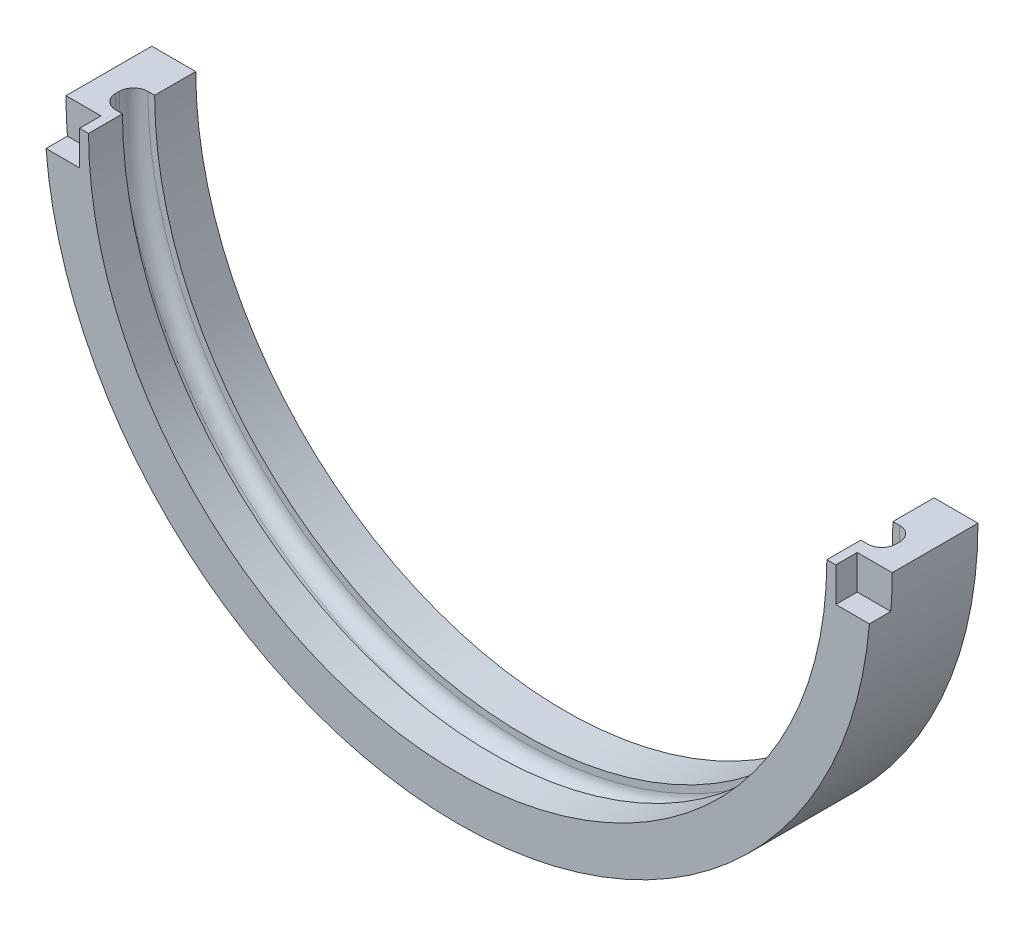
ISO-10303-21;
HEADER;
FILE_DESCRIPTION(('STEP AP214'),'2;1');
FILE_NAME('part.step','',(''),(''),'','','');
FILE_SCHEMA(('AUTOMOTIVE_DESIGN { 1 0 10303 214 1 1 1 1 }'));
ENDSEC;
DATA;
#1=APPLICATION_CONTEXT('core data for automotive mechanical design processes');
#2=APPLICATION_PROTOCOL_DEFINITION('international standard','automotive_design',2000,#1);
#3=PRODUCT_CONTEXT('',#1,'mechanical');
#4=PRODUCT('Part','Part','',(#3));
#5=PRODUCT_RELATED_PRODUCT_CATEGORY('part','',(#4));
#6=PRODUCT_DEFINITION_FORMATION('','',#4);
#7=PRODUCT_DEFINITION_CONTEXT('part definition',#1,'design');
#8=PRODUCT_DEFINITION('design','',#6,#7);
#9=PRODUCT_DEFINITION_SHAPE('','',#8);
#10=(LENGTH_UNIT() NAMED_UNIT(*) SI_UNIT(.MILLI.,.METRE.));
#11=(NAMED_UNIT(*) PLANE_ANGLE_UNIT() SI_UNIT($,.RADIAN.));
#12=(NAMED_UNIT(*) SI_UNIT($,.STERADIAN.) SOLID_ANGLE_UNIT());
#13=UNCERTAINTY_MEASURE_WITH_UNIT(LENGTH_MEASURE(1.E-05),#10,'distance_accuracy_value','');
#14=(GEOMETRIC_REPRESENTATION_CONTEXT(3) GLOBAL_UNCERTAINTY_ASSIGNED_CONTEXT((#13)) GLOBAL_UNIT_ASSIGNED_CONTEXT((#10,
#11,#12)) REPRESENTATION_CONTEXT('',''));
#15=CARTESIAN_POINT('',(0.,0.,0.));
#16=DIRECTION('',(0.,0.,1.));
#17=DIRECTION('',(1.,0.,0.));
#18=AXIS2_PLACEMENT_3D('',#15,#16,#17);
#19=CARTESIAN_POINT('',(0.,73.406,5.715));
#20=DIRECTION('',(0.,0.,-1.));
#21=DIRECTION('',(-1.,0.,0.));
#22=AXIS2_PLACEMENT_3D('',#19,#20,#21);
#23=CYLINDRICAL_SURFACE('',#22,69.342);
#24=DIRECTION('',(0.,0.,-1.));
#25=VECTOR('',#24,1.);
#26=CARTESIAN_POINT('',(-69.342,73.406,5.715));
#27=LINE('',#26,#25);
#28=CARTESIAN_POINT('',(-69.342,73.406,3.175));
#29=VERTEX_POINT('',#28);
#30=CARTESIAN_POINT('',(-69.342,73.406,2.54));
#31=VERTEX_POINT('',#30);
#32=EDGE_CURVE('E254',#29,#31,#27,.T.);
#33=ORIENTED_EDGE('',*,*,#32,.F.);
#34=CARTESIAN_POINT('',(0.,73.406,3.175));
#35=DIRECTION('',(0.,0.,1.));
#36=DIRECTION('',(1.,0.,0.));
#37=AXIS2_PLACEMENT_3D('',#34,#35,#36);
#38=CIRCLE('',#37,69.342);
#39=CARTESIAN_POINT('',(69.342,73.406,3.175));
#40=VERTEX_POINT('',#39);
#41=EDGE_CURVE('E259',#29,#40,#38,.T.);
#42=ORIENTED_EDGE('',*,*,#41,.T.);
#43=DIRECTION('',(0.,0.,-1.));
#44=VECTOR('',#43,1.);
#45=CARTESIAN_POINT('',(69.342,73.406,5.715));
#46=LINE('',#45,#44);
#47=CARTESIAN_POINT('',(69.342,73.406,2.54));
#48=VERTEX_POINT('',#47);
#49=EDGE_CURVE('E248',#40,#48,#46,.T.);
#50=ORIENTED_EDGE('',*,*,#49,.T.);
#51=CARTESIAN_POINT('',(0.,73.406,2.54));
#52=DIRECTION('',(0.,0.,-1.));
#53=DIRECTION('',(-1.,0.,0.));
#54=AXIS2_PLACEMENT_3D('',#51,#52,#53);
#55=CIRCLE('',#54,69.342);
#56=EDGE_CURVE('E257',#48,#31,#55,.T.);
#57=ORIENTED_EDGE('',*,*,#56,.T.);
#58=EDGE_LOOP('',(#33,#42,#50,#57));
#59=FACE_BOUND('',#58,.T.);
#60=ADVANCED_FACE('F37',(#59),#23,.F.);
#61=CARTESIAN_POINT('',(0.,73.406,5.715));
#62=DIRECTION('',(0.,-1.,0.));
#63=DIRECTION('',(0.,0.,-1.));
#64=AXIS2_PLACEMENT_3D('',#61,#62,#63);
#65=PLANE('',#64);
#66=DIRECTION('',(-1.,0.,0.));
#67=VECTOR('',#66,1.);
#68=CARTESIAN_POINT('',(-67.1838804106557,73.406,7.9375));
#69=LINE('',#68,#67);
#70=CARTESIAN_POINT('',(-67.1838804106557,73.406,7.9375));
#71=VERTEX_POINT('',#70);
#72=CARTESIAN_POINT('',(-73.406,73.406,7.9375));
#73=VERTEX_POINT('',#72);
#74=EDGE_CURVE('E167',#71,#73,#69,.T.);
#75=ORIENTED_EDGE('',*,*,#74,.F.);
#76=DIRECTION('',(0.,0.,1.));
#77=VECTOR('',#76,1.);
#78=CARTESIAN_POINT('',(-67.1838804106557,73.406,7.9375));
#79=LINE('',#78,#77);
#80=CARTESIAN_POINT('',(-67.1838804106557,73.406,11.7475));
#81=VERTEX_POINT('',#80);
#82=EDGE_CURVE('E151',#71,#81,#79,.T.);
#83=ORIENTED_EDGE('',*,*,#82,.T.);
#84=DIRECTION('',(-1.,0.,0.));
#85=VECTOR('',#84,1.);
#86=CARTESIAN_POINT('',(0.,73.406,11.7475));
#87=LINE('',#86,#85);
#88=CARTESIAN_POINT('',(-65.5955,73.406,11.7475));
#89=VERTEX_POINT('',#88);
#90=EDGE_CURVE('E228',#89,#81,#87,.T.);
#91=ORIENTED_EDGE('',*,*,#90,.F.);
#92=DIRECTION('',(0.,0.,-1.));
#93=VECTOR('',#92,1.);
#94=CARTESIAN_POINT('',(-65.5955,73.406,11.7475));
#95=LINE('',#94,#93);
#96=CARTESIAN_POINT('',(-65.5955,73.406,5.715));
#97=VERTEX_POINT('',#96);
#98=EDGE_CURVE('E246',#89,#97,#95,.T.);
#99=ORIENTED_EDGE('',*,*,#98,.T.);
#100=DIRECTION('',(-1.,0.,0.));
#101=VECTOR('',#100,1.);
#102=CARTESIAN_POINT('',(0.,73.406,5.715));
#103=LINE('',#102,#101);
#104=CARTESIAN_POINT('',(-66.802,73.406,5.715));
#105=VERTEX_POINT('',#104);
#106=EDGE_CURVE('E240',#97,#105,#103,.T.);
#107=ORIENTED_EDGE('',*,*,#106,.T.);
#108=CARTESIAN_POINT('',(-66.802,73.406,3.175));
#109=DIRECTION('',(0.,-1.,0.));
#110=DIRECTION('',(0.,0.,-1.));
#111=AXIS2_PLACEMENT_3D('',#108,#109,#110);
#112=CIRCLE('',#111,2.54);
#113=EDGE_CURVE('E269',#105,#29,#112,.T.);
#114=ORIENTED_EDGE('',*,*,#113,.T.);
#115=ORIENTED_EDGE('',*,*,#32,.T.);
#116=CARTESIAN_POINT('',(-66.802,73.406,2.54));
#117=DIRECTION('',(0.,-1.,0.));
#118=DIRECTION('',(0.,0.,-1.));
#119=AXIS2_PLACEMENT_3D('',#116,#117,#118);
#120=CIRCLE('',#119,2.54);
#121=CARTESIAN_POINT('',(-66.802,73.406,0.));
#122=VERTEX_POINT('',#121);
#123=EDGE_CURVE('E273',#31,#122,#120,.T.);
#124=ORIENTED_EDGE('',*,*,#123,.T.);
#125=DIRECTION('',(-1.,0.,0.));
#126=VECTOR('',#125,1.);
#127=CARTESIAN_POINT('',(0.,73.406,0.));
#128=LINE('',#127,#126);
#129=CARTESIAN_POINT('',(-65.5955,73.406,0.));
#130=VERTEX_POINT('',#129);
#131=EDGE_CURVE('E205',#130,#122,#128,.T.);
#132=ORIENTED_EDGE('',*,*,#131,.F.);
#133=DIRECTION('',(0.,0.,1.));
#134=VECTOR('',#133,1.);
#135=CARTESIAN_POINT('',(-65.5955,73.406,-7.3025));
#136=LINE('',#135,#134);
#137=CARTESIAN_POINT('',(-65.5955,73.406,-7.3025));
#138=VERTEX_POINT('',#137);
#139=EDGE_CURVE('E213',#138,#130,#136,.T.);
#140=ORIENTED_EDGE('',*,*,#139,.F.);
#141=DIRECTION('',(-1.,0.,0.));
#142=VECTOR('',#141,1.);
#143=CARTESIAN_POINT('',(0.,73.406,-7.3025));
#144=LINE('',#143,#142);
#145=CARTESIAN_POINT('',(-73.406,73.406,-7.3025));
#146=VERTEX_POINT('',#145);
#147=EDGE_CURVE('E211',#138,#146,#144,.T.);
#148=ORIENTED_EDGE('',*,*,#147,.T.);
#149=DIRECTION('',(0.,0.,-1.));
#150=VECTOR('',#149,1.);
#151=CARTESIAN_POINT('',(-73.406,73.406,5.715));
#152=LINE('',#151,#150);
#153=EDGE_CURVE('E173',#73,#146,#152,.T.);
#154=ORIENTED_EDGE('',*,*,#153,.F.);
#155=EDGE_LOOP('',(#75,#83,#91,#99,#107,#114,#115,#124,#132,#140,#148,#154));
#156=FACE_BOUND('',#155,.T.);
#157=ADVANCED_FACE('F171',(#156),#65,.F.);
#158=CARTESIAN_POINT('',(0.,73.406,5.715));
#159=DIRECTION('',(0.,0.,-1.));
#160=DIRECTION('',(-1.,0.,0.));
#161=AXIS2_PLACEMENT_3D('',#158,#159,#160);
#162=CYLINDRICAL_SURFACE('',#161,73.406);
#163=CARTESIAN_POINT('',(0.,73.406,11.7475));
#164=DIRECTION('',(0.,0.,1.));
#165=DIRECTION('',(1.,0.,0.));
#166=AXIS2_PLACEMENT_3D('',#163,#164,#165);
#167=CIRCLE('',#166,73.406);
#168=CARTESIAN_POINT('',(-73.1524409708931,67.31,11.7475));
#169=VERTEX_POINT('',#168);
#170=CARTESIAN_POINT('',(73.1524409708931,67.31,11.7475));
#171=VERTEX_POINT('',#170);
#172=EDGE_CURVE('E231',#169,#171,#167,.T.);
#173=ORIENTED_EDGE('',*,*,#172,.F.);
#174=DIRECTION('',(0.,0.,-1.));
#175=VECTOR('',#174,1.);
#176=CARTESIAN_POINT('',(-73.1524409708931,67.31,5.715));
#177=LINE('',#176,#175);
#178=CARTESIAN_POINT('',(-73.1524409708931,67.31,7.9375));
#179=VERTEX_POINT('',#178);
#180=EDGE_CURVE('E60',#169,#179,#177,.T.);
#181=ORIENTED_EDGE('',*,*,#180,.T.);
#182=CARTESIAN_POINT('',(0.,73.406,7.9375));
#183=DIRECTION('',(0.,0.,-1.));
#184=DIRECTION('',(-1.,0.,0.));
#185=AXIS2_PLACEMENT_3D('',#182,#183,#184);
#186=CIRCLE('',#185,73.406);
#187=EDGE_CURVE('E12',#179,#73,#186,.T.);
#188=ORIENTED_EDGE('',*,*,#187,.T.);
#189=ORIENTED_EDGE('',*,*,#153,.T.);
#190=CARTESIAN_POINT('',(0.,73.406,-7.3025));
#191=DIRECTION('',(0.,0.,-1.));
#192=DIRECTION('',(-1.,0.,0.));
#193=AXIS2_PLACEMENT_3D('',#190,#191,#192);
#194=CIRCLE('',#193,73.406);
#195=CARTESIAN_POINT('',(73.406,73.406,-7.3025));
#196=VERTEX_POINT('',#195);
#197=EDGE_CURVE('E208',#196,#146,#194,.T.);
#198=ORIENTED_EDGE('',*,*,#197,.F.);
#199=DIRECTION('',(0.,0.,-1.));
#200=VECTOR('',#199,1.);
#201=CARTESIAN_POINT('',(73.406,73.406,5.715));
#202=LINE('',#201,#200);
#203=CARTESIAN_POINT('',(73.406,73.406,7.9375));
#204=VERTEX_POINT('',#203);
#205=EDGE_CURVE('E251',#204,#196,#202,.T.);
#206=ORIENTED_EDGE('',*,*,#205,.F.);
#207=CARTESIAN_POINT('',(0.,73.406,7.9375));
#208=DIRECTION('',(0.,0.,1.));
#209=DIRECTION('',(1.,0.,0.));
#210=AXIS2_PLACEMENT_3D('',#207,#208,#209);
#211=CIRCLE('',#210,73.406);
#212=CARTESIAN_POINT('',(73.1524409708931,67.31,7.9375));
#213=VERTEX_POINT('',#212);
#214=EDGE_CURVE('E198',#213,#204,#211,.T.);
#215=ORIENTED_EDGE('',*,*,#214,.F.);
#216=DIRECTION('',(0.,0.,-1.));
#217=VECTOR('',#216,1.);
#218=CARTESIAN_POINT('',(73.1524409708931,67.31,5.715));
#219=LINE('',#218,#217);
#220=EDGE_CURVE('E179',#213,#171,#219,.F.);
#221=ORIENTED_EDGE('',*,*,#220,.T.);
#222=EDGE_LOOP('',(#173,#181,#188,#189,#198,#206,#215,#221));
#223=FACE_BOUND('',#222,.T.);
#224=ADVANCED_FACE('F317',(#223),#162,.T.);
#225=CARTESIAN_POINT('',(0.,73.406,5.715));
#226=DIRECTION('',(0.,1.,0.));
#227=DIRECTION('',(0.,0.,1.));
#228=AXIS2_PLACEMENT_3D('',#225,#226,#227);
#229=PLANE('',#228);
#230=DIRECTION('',(0.,0.,1.));
#231=VECTOR('',#230,1.);
#232=CARTESIAN_POINT('',(67.1838804106557,73.406,7.9375));
#233=LINE('',#232,#231);
#234=CARTESIAN_POINT('',(67.1838804106557,73.406,7.9375));
#235=VERTEX_POINT('',#234);
#236=CARTESIAN_POINT('',(67.1838804106557,73.406,11.7475));
#237=VERTEX_POINT('',#236);
#238=EDGE_CURVE('E178',#235,#237,#233,.T.);
#239=ORIENTED_EDGE('',*,*,#238,.F.);
#240=DIRECTION('',(-1.,0.,0.));
#241=VECTOR('',#240,1.);
#242=CARTESIAN_POINT('',(67.1838804106557,73.406,7.9375));
#243=LINE('',#242,#241);
#244=EDGE_CURVE('E188',#204,#235,#243,.T.);
#245=ORIENTED_EDGE('',*,*,#244,.F.);
#246=ORIENTED_EDGE('',*,*,#205,.T.);
#247=DIRECTION('',(1.,0.,0.));
#248=VECTOR('',#247,1.);
#249=CARTESIAN_POINT('',(0.,73.406,-7.3025));
#250=LINE('',#249,#248);
#251=CARTESIAN_POINT('',(65.5955,73.406,-7.3025));
#252=VERTEX_POINT('',#251);
#253=EDGE_CURVE('E204',#252,#196,#250,.T.);
#254=ORIENTED_EDGE('',*,*,#253,.F.);
#255=DIRECTION('',(0.,0.,1.));
#256=VECTOR('',#255,1.);
#257=CARTESIAN_POINT('',(65.5955,73.406,-7.3025));
#258=LINE('',#257,#256);
#259=CARTESIAN_POINT('',(65.5955,73.406,0.));
#260=VERTEX_POINT('',#259);
#261=EDGE_CURVE('E222',#252,#260,#258,.T.);
#262=ORIENTED_EDGE('',*,*,#261,.T.);
#263=DIRECTION('',(1.,0.,0.));
#264=VECTOR('',#263,1.);
#265=CARTESIAN_POINT('',(0.,73.406,0.));
#266=LINE('',#265,#264);
#267=CARTESIAN_POINT('',(66.802,73.406,0.));
#268=VERTEX_POINT('',#267);
#269=EDGE_CURVE('E216',#260,#268,#266,.T.);
#270=ORIENTED_EDGE('',*,*,#269,.T.);
#271=CARTESIAN_POINT('',(66.802,73.406,2.54));
#272=DIRECTION('',(0.,1.,0.));
#273=DIRECTION('',(0.,0.,1.));
#274=AXIS2_PLACEMENT_3D('',#271,#272,#273);
#275=CIRCLE('',#274,2.54);
#276=EDGE_CURVE('E271',#268,#48,#275,.F.);
#277=ORIENTED_EDGE('',*,*,#276,.T.);
#278=ORIENTED_EDGE('',*,*,#49,.F.);
#279=CARTESIAN_POINT('',(66.802,73.406,3.175));
#280=DIRECTION('',(0.,1.,0.));
#281=DIRECTION('',(0.,0.,1.));
#282=AXIS2_PLACEMENT_3D('',#279,#280,#281);
#283=CIRCLE('',#282,2.54);
#284=CARTESIAN_POINT('',(66.802,73.406,5.715));
#285=VERTEX_POINT('',#284);
#286=EDGE_CURVE('E267',#40,#285,#283,.F.);
#287=ORIENTED_EDGE('',*,*,#286,.T.);
#288=DIRECTION('',(1.,0.,0.));
#289=VECTOR('',#288,1.);
#290=CARTESIAN_POINT('',(0.,73.406,5.715));
#291=LINE('',#290,#289);
#292=CARTESIAN_POINT('',(65.5955,73.406,5.715));
#293=VERTEX_POINT('',#292);
#294=EDGE_CURVE('E229',#293,#285,#291,.T.);
#295=ORIENTED_EDGE('',*,*,#294,.F.);
#296=DIRECTION('',(0.,0.,-1.));
#297=VECTOR('',#296,1.);
#298=CARTESIAN_POINT('',(65.5955,73.406,11.7475));
#299=LINE('',#298,#297);
#300=CARTESIAN_POINT('',(65.5955,73.406,11.7475));
#301=VERTEX_POINT('',#300);
#302=EDGE_CURVE('E237',#301,#293,#299,.T.);
#303=ORIENTED_EDGE('',*,*,#302,.F.);
#304=DIRECTION('',(1.,0.,0.));
#305=VECTOR('',#304,1.);
#306=CARTESIAN_POINT('',(0.,73.406,11.7475));
#307=LINE('',#306,#305);
#308=EDGE_CURVE('E234',#301,#237,#307,.T.);
#309=ORIENTED_EDGE('',*,*,#308,.T.);
#310=EDGE_LOOP('',(#239,#245,#246,#254,#262,#270,#277,#278,#287,#295,#303,#309));
#311=FACE_BOUND('',#310,.T.);
#312=ADVANCED_FACE('F291',(#311),#229,.T.);
#313=CARTESIAN_POINT('',(0.,0.,5.715));
#314=DIRECTION('',(0.,0.,1.));
#315=DIRECTION('',(1.,0.,0.));
#316=AXIS2_PLACEMENT_3D('',#313,#314,#315);
#317=PLANE('',#316);
#318=ORIENTED_EDGE('',*,*,#294,.T.);
#319=CARTESIAN_POINT('',(0.,73.406,5.715));
#320=DIRECTION('',(0.,0.,1.));
#321=DIRECTION('',(1.,0.,0.));
#322=AXIS2_PLACEMENT_3D('',#319,#320,#321);
#323=CIRCLE('',#322,66.802);
#324=EDGE_CURVE('E262',#285,#105,#323,.F.);
#325=ORIENTED_EDGE('',*,*,#324,.T.);
#326=ORIENTED_EDGE('',*,*,#106,.F.);
#327=CARTESIAN_POINT('',(0.,73.406,5.715));
#328=DIRECTION('',(0.,0.,1.));
#329=DIRECTION('',(1.,0.,0.));
#330=AXIS2_PLACEMENT_3D('',#327,#328,#329);
#331=CIRCLE('',#330,65.5955);
#332=EDGE_CURVE('E224',#97,#293,#331,.T.);
#333=ORIENTED_EDGE('',*,*,#332,.T.);
#334=EDGE_LOOP('',(#318,#325,#326,#333));
#335=FACE_BOUND('',#334,.T.);
#336=ADVANCED_FACE('F285',(#335),#317,.F.);
#337=CARTESIAN_POINT('',(0.,73.406,11.7475));
#338=DIRECTION('',(0.,0.,-1.));
#339=DIRECTION('',(-1.,0.,0.));
#340=AXIS2_PLACEMENT_3D('',#337,#338,#339);
#341=CYLINDRICAL_SURFACE('',#340,65.5955);
#342=ORIENTED_EDGE('',*,*,#332,.F.);
#343=ORIENTED_EDGE('',*,*,#98,.F.);
#344=CARTESIAN_POINT('',(0.,73.406,11.7475));
#345=DIRECTION('',(0.,0.,1.));
#346=DIRECTION('',(1.,0.,0.));
#347=AXIS2_PLACEMENT_3D('',#344,#345,#346);
#348=CIRCLE('',#347,65.5955);
#349=EDGE_CURVE('E225',#89,#301,#348,.T.);
#350=ORIENTED_EDGE('',*,*,#349,.T.);
#351=ORIENTED_EDGE('',*,*,#302,.T.);
#352=EDGE_LOOP('',(#342,#343,#350,#351));
#353=FACE_BOUND('',#352,.T.);
#354=ADVANCED_FACE('F288',(#353),#341,.F.);
#355=CARTESIAN_POINT('',(0.,0.,11.7475));
#356=DIRECTION('',(0.,0.,1.));
#357=DIRECTION('',(1.,0.,0.));
#358=AXIS2_PLACEMENT_3D('',#355,#356,#357);
#359=PLANE('',#358);
#360=DIRECTION('',(0.,1.,0.));
#361=VECTOR('',#360,1.);
#362=CARTESIAN_POINT('',(-67.1838804106557,73.406,11.7475));
#363=LINE('',#362,#361);
#364=CARTESIAN_POINT('',(-67.1838804106557,67.31,11.7475));
#365=VERTEX_POINT('',#364);
#366=EDGE_CURVE('E157',#365,#81,#363,.T.);
#367=ORIENTED_EDGE('',*,*,#366,.F.);
#368=DIRECTION('',(1.,0.,0.));
#369=VECTOR('',#368,1.);
#370=CARTESIAN_POINT('',(0.,67.31,11.7475));
#371=LINE('',#370,#369);
#372=EDGE_CURVE('E45',#169,#365,#371,.T.);
#373=ORIENTED_EDGE('',*,*,#372,.F.);
#374=ORIENTED_EDGE('',*,*,#172,.T.);
#375=DIRECTION('',(1.,0.,0.));
#376=VECTOR('',#375,1.);
#377=CARTESIAN_POINT('',(67.1838804106557,67.31,11.7475));
#378=LINE('',#377,#376);
#379=CARTESIAN_POINT('',(67.1838804106557,67.31,11.7475));
#380=VERTEX_POINT('',#379);
#381=EDGE_CURVE('E185',#380,#171,#378,.T.);
#382=ORIENTED_EDGE('',*,*,#381,.F.);
#383=DIRECTION('',(0.,-1.,0.));
#384=VECTOR('',#383,1.);
#385=CARTESIAN_POINT('',(67.1838804106557,73.406,11.7475));
#386=LINE('',#385,#384);
#387=EDGE_CURVE('E52',#237,#380,#386,.T.);
#388=ORIENTED_EDGE('',*,*,#387,.F.);
#389=ORIENTED_EDGE('',*,*,#308,.F.);
#390=ORIENTED_EDGE('',*,*,#349,.F.);
#391=ORIENTED_EDGE('',*,*,#90,.T.);
#392=EDGE_LOOP('',(#367,#373,#374,#382,#388,#389,#390,#391));
#393=FACE_BOUND('',#392,.T.);
#394=ADVANCED_FACE('F277',(#393),#359,.T.);
#395=CARTESIAN_POINT('',(0.,0.,0.));
#396=DIRECTION('',(0.,0.,-1.));
#397=DIRECTION('',(-1.,0.,0.));
#398=AXIS2_PLACEMENT_3D('',#395,#396,#397);
#399=PLANE('',#398);
#400=ORIENTED_EDGE('',*,*,#131,.T.);
#401=CARTESIAN_POINT('',(0.,73.406,0.));
#402=DIRECTION('',(0.,0.,-1.));
#403=DIRECTION('',(-1.,0.,0.));
#404=AXIS2_PLACEMENT_3D('',#401,#402,#403);
#405=CIRCLE('',#404,66.802);
#406=EDGE_CURVE('E264',#122,#268,#405,.F.);
#407=ORIENTED_EDGE('',*,*,#406,.T.);
#408=ORIENTED_EDGE('',*,*,#269,.F.);
#409=CARTESIAN_POINT('',(0.,73.406,0.));
#410=DIRECTION('',(0.,0.,-1.));
#411=DIRECTION('',(-1.,0.,0.));
#412=AXIS2_PLACEMENT_3D('',#409,#410,#411);
#413=CIRCLE('',#412,65.5955);
#414=EDGE_CURVE('E200',#260,#130,#413,.T.);
#415=ORIENTED_EDGE('',*,*,#414,.T.);
#416=EDGE_LOOP('',(#400,#407,#408,#415));
#417=FACE_BOUND('',#416,.T.);
#418=ADVANCED_FACE('F304',(#417),#399,.F.);
#419=CARTESIAN_POINT('',(0.,73.406,-7.3025));
#420=DIRECTION('',(0.,0.,1.));
#421=DIRECTION('',(1.,0.,0.));
#422=AXIS2_PLACEMENT_3D('',#419,#420,#421);
#423=CYLINDRICAL_SURFACE('',#422,65.5955);
#424=ORIENTED_EDGE('',*,*,#414,.F.);
#425=ORIENTED_EDGE('',*,*,#261,.F.);
#426=CARTESIAN_POINT('',(0.,73.406,-7.3025));
#427=DIRECTION('',(0.,0.,-1.));
#428=DIRECTION('',(-1.,0.,0.));
#429=AXIS2_PLACEMENT_3D('',#426,#427,#428);
#430=CIRCLE('',#429,65.5955);
#431=EDGE_CURVE('E201',#252,#138,#430,.T.);
#432=ORIENTED_EDGE('',*,*,#431,.T.);
#433=ORIENTED_EDGE('',*,*,#139,.T.);
#434=EDGE_LOOP('',(#424,#425,#432,#433));
#435=FACE_BOUND('',#434,.T.);
#436=ADVANCED_FACE('F308',(#435),#423,.F.);
#437=CARTESIAN_POINT('',(0.,0.,-7.3025));
#438=DIRECTION('',(0.,0.,-1.));
#439=DIRECTION('',(-1.,0.,0.));
#440=AXIS2_PLACEMENT_3D('',#437,#438,#439);
#441=PLANE('',#440);
#442=ORIENTED_EDGE('',*,*,#431,.F.);
#443=ORIENTED_EDGE('',*,*,#253,.T.);
#444=ORIENTED_EDGE('',*,*,#197,.T.);
#445=ORIENTED_EDGE('',*,*,#147,.F.);
#446=EDGE_LOOP('',(#442,#443,#444,#445));
#447=FACE_BOUND('',#446,.T.);
#448=ADVANCED_FACE('F313',(#447),#441,.T.);
#449=CARTESIAN_POINT('',(0.,73.406,3.175));
#450=DIRECTION('',(0.,0.,1.));
#451=DIRECTION('',(1.,0.,0.));
#452=AXIS2_PLACEMENT_3D('',#449,#450,#451);
#453=TOROIDAL_SURFACE('',#452,66.802,2.54);
#454=ORIENTED_EDGE('',*,*,#113,.F.);
#455=ORIENTED_EDGE('',*,*,#324,.F.);
#456=ORIENTED_EDGE('',*,*,#286,.F.);
#457=ORIENTED_EDGE('',*,*,#41,.F.);
#458=EDGE_LOOP('',(#454,#455,#456,#457));
#459=FACE_BOUND('',#458,.T.);
#460=ADVANCED_FACE('F294',(#459),#453,.F.);
#461=CARTESIAN_POINT('',(0.,73.406,2.54));
#462=DIRECTION('',(0.,0.,-1.));
#463=DIRECTION('',(-1.,0.,0.));
#464=AXIS2_PLACEMENT_3D('',#461,#462,#463);
#465=TOROIDAL_SURFACE('',#464,66.802,2.54);
#466=ORIENTED_EDGE('',*,*,#123,.F.);
#467=ORIENTED_EDGE('',*,*,#56,.F.);
#468=ORIENTED_EDGE('',*,*,#276,.F.);
#469=ORIENTED_EDGE('',*,*,#406,.F.);
#470=EDGE_LOOP('',(#466,#467,#468,#469));
#471=FACE_BOUND('',#470,.T.);
#472=ADVANCED_FACE('F39',(#471),#465,.F.);
#473=CARTESIAN_POINT('',(0.,0.,7.9375));
#474=DIRECTION('',(0.,0.,1.));
#475=DIRECTION('',(1.,0.,0.));
#476=AXIS2_PLACEMENT_3D('',#473,#474,#475);
#477=PLANE('',#476);
#478=ORIENTED_EDGE('',*,*,#214,.T.);
#479=ORIENTED_EDGE('',*,*,#244,.T.);
#480=DIRECTION('',(0.,-1.,0.));
#481=VECTOR('',#480,1.);
#482=CARTESIAN_POINT('',(67.1838804106557,73.406,7.9375));
#483=LINE('',#482,#481);
#484=CARTESIAN_POINT('',(67.1838804106557,67.31,7.9375));
#485=VERTEX_POINT('',#484);
#486=EDGE_CURVE('E181',#235,#485,#483,.T.);
#487=ORIENTED_EDGE('',*,*,#486,.T.);
#488=DIRECTION('',(1.,0.,0.));
#489=VECTOR('',#488,1.);
#490=CARTESIAN_POINT('',(67.1838804106557,67.31,7.9375));
#491=LINE('',#490,#489);
#492=EDGE_CURVE('E184',#485,#213,#491,.T.);
#493=ORIENTED_EDGE('',*,*,#492,.T.);
#494=EDGE_LOOP('',(#478,#479,#487,#493));
#495=FACE_BOUND('',#494,.T.);
#496=ADVANCED_FACE('F327',(#495),#477,.T.);
#497=CARTESIAN_POINT('',(67.1838804106557,67.31,7.9375));
#498=DIRECTION('',(0.,-1.,0.));
#499=DIRECTION('',(0.,0.,-1.));
#500=AXIS2_PLACEMENT_3D('',#497,#498,#499);
#501=PLANE('',#500);
#502=ORIENTED_EDGE('',*,*,#492,.F.);
#503=DIRECTION('',(0.,0.,1.));
#504=VECTOR('',#503,1.);
#505=CARTESIAN_POINT('',(67.1838804106557,67.31,7.9375));
#506=LINE('',#505,#504);
#507=EDGE_CURVE('E190',#485,#380,#506,.T.);
#508=ORIENTED_EDGE('',*,*,#507,.T.);
#509=ORIENTED_EDGE('',*,*,#381,.T.);
#510=ORIENTED_EDGE('',*,*,#220,.F.);
#511=EDGE_LOOP('',(#502,#508,#509,#510));
#512=FACE_BOUND('',#511,.T.);
#513=ADVANCED_FACE('F322',(#512),#501,.F.);
#514=CARTESIAN_POINT('',(67.1838804106557,73.406,7.9375));
#515=DIRECTION('',(-1.,0.,0.));
#516=DIRECTION('',(0.,0.,1.));
#517=AXIS2_PLACEMENT_3D('',#514,#515,#516);
#518=PLANE('',#517);
#519=ORIENTED_EDGE('',*,*,#387,.T.);
#520=ORIENTED_EDGE('',*,*,#507,.F.);
#521=ORIENTED_EDGE('',*,*,#486,.F.);
#522=ORIENTED_EDGE('',*,*,#238,.T.);
#523=EDGE_LOOP('',(#519,#520,#521,#522));
#524=FACE_BOUND('',#523,.T.);
#525=ADVANCED_FACE('F324',(#524),#518,.F.);
#526=CARTESIAN_POINT('',(0.,0.,7.9375));
#527=DIRECTION('',(0.,0.,-1.));
#528=DIRECTION('',(-1.,0.,0.));
#529=AXIS2_PLACEMENT_3D('',#526,#527,#528);
#530=PLANE('',#529);
#531=DIRECTION('',(1.,0.,0.));
#532=VECTOR('',#531,1.);
#533=CARTESIAN_POINT('',(-67.1838804106557,67.31,7.9375));
#534=LINE('',#533,#532);
#535=CARTESIAN_POINT('',(-67.1838804106557,67.31,7.9375));
#536=VERTEX_POINT('',#535);
#537=EDGE_CURVE('E163',#179,#536,#534,.T.);
#538=ORIENTED_EDGE('',*,*,#537,.T.);
#539=DIRECTION('',(0.,1.,0.));
#540=VECTOR('',#539,1.);
#541=CARTESIAN_POINT('',(-67.1838804106557,73.406,7.9375));
#542=LINE('',#541,#540);
#543=EDGE_CURVE('E155',#536,#71,#542,.T.);
#544=ORIENTED_EDGE('',*,*,#543,.T.);
#545=ORIENTED_EDGE('',*,*,#74,.T.);
#546=ORIENTED_EDGE('',*,*,#187,.F.);
#547=EDGE_LOOP('',(#538,#544,#545,#546));
#548=FACE_BOUND('',#547,.T.);
#549=ADVANCED_FACE('F166',(#548),#530,.F.);
#550=CARTESIAN_POINT('',(-67.1838804106557,67.31,7.9375));
#551=DIRECTION('',(0.,-1.,0.));
#552=DIRECTION('',(0.,0.,-1.));
#553=AXIS2_PLACEMENT_3D('',#550,#551,#552);
#554=PLANE('',#553);
#555=ORIENTED_EDGE('',*,*,#372,.T.);
#556=DIRECTION('',(0.,0.,1.));
#557=VECTOR('',#556,1.);
#558=CARTESIAN_POINT('',(-67.1838804106557,67.31,7.9375));
#559=LINE('',#558,#557);
#560=EDGE_CURVE('E162',#536,#365,#559,.T.);
#561=ORIENTED_EDGE('',*,*,#560,.F.);
#562=ORIENTED_EDGE('',*,*,#537,.F.);
#563=ORIENTED_EDGE('',*,*,#180,.F.);
#564=EDGE_LOOP('',(#555,#561,#562,#563));
#565=FACE_BOUND('',#564,.T.);
#566=ADVANCED_FACE('F274',(#565),#554,.F.);
#567=CARTESIAN_POINT('',(-67.1838804106557,73.406,7.9375));
#568=DIRECTION('',(1.,0.,0.));
#569=DIRECTION('',(0.,0.,-1.));
#570=AXIS2_PLACEMENT_3D('',#567,#568,#569);
#571=PLANE('',#570);
#572=ORIENTED_EDGE('',*,*,#366,.T.);
#573=ORIENTED_EDGE('',*,*,#82,.F.);
#574=ORIENTED_EDGE('',*,*,#543,.F.);
#575=ORIENTED_EDGE('',*,*,#560,.T.);
#576=EDGE_LOOP('',(#572,#573,#574,#575));
#577=FACE_BOUND('',#576,.T.);
#578=ADVANCED_FACE('F153',(#577),#571,.F.);
#579=CLOSED_SHELL('',(#60,#157,#224,#312,#336,#354,#394,#418,#436,#448,#460,#472,#496,#513,#525,
#549,#566,#578));
#580=MANIFOLD_SOLID_BREP('B2',#579);
#581=ADVANCED_BREP_SHAPE_REPRESENTATION('',(#18,#580),#14);
#582=SHAPE_DEFINITION_REPRESENTATION(#9,#581);
ENDSEC;
END-ISO-10303-21;
